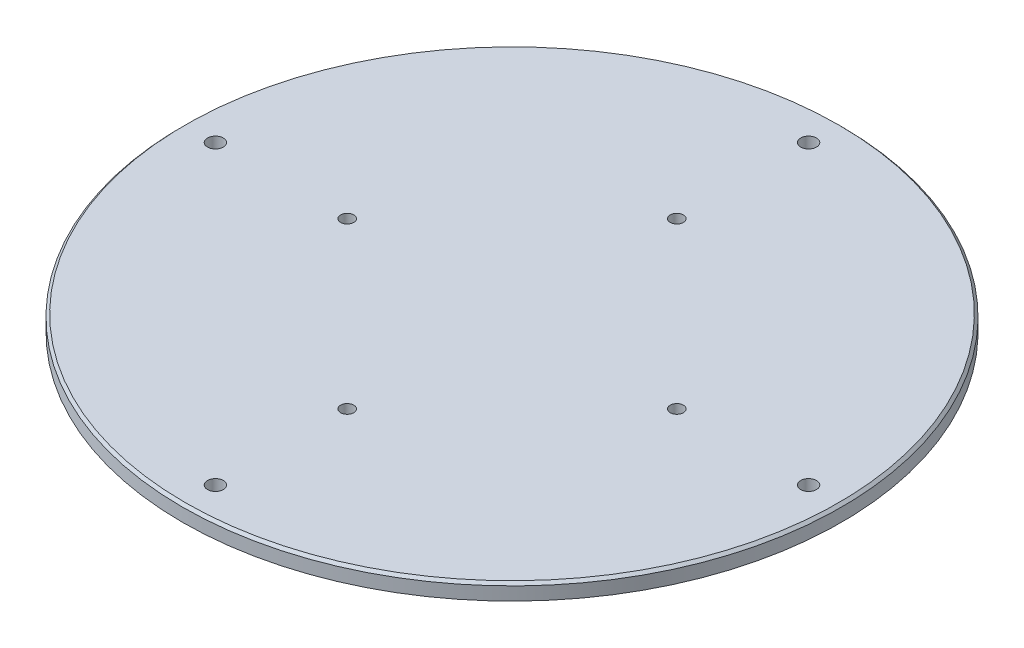
ISO-10303-21;
HEADER;
FILE_DESCRIPTION(('STEP AP214'),'2;1');
FILE_NAME('part.step','',(''),(''),'','','');
FILE_SCHEMA(('AUTOMOTIVE_DESIGN { 1 0 10303 214 1 1 1 1 }'));
ENDSEC;
DATA;
#1=APPLICATION_CONTEXT('core data for automotive mechanical design processes');
#2=APPLICATION_PROTOCOL_DEFINITION('international standard','automotive_design',2000,#1);
#3=PRODUCT_CONTEXT('',#1,'mechanical');
#4=PRODUCT('Part','Part','',(#3));
#5=PRODUCT_RELATED_PRODUCT_CATEGORY('part','',(#4));
#6=PRODUCT_DEFINITION_FORMATION('','',#4);
#7=PRODUCT_DEFINITION_CONTEXT('part definition',#1,'design');
#8=PRODUCT_DEFINITION('design','',#6,#7);
#9=PRODUCT_DEFINITION_SHAPE('','',#8);
#10=(LENGTH_UNIT() NAMED_UNIT(*) SI_UNIT(.MILLI.,.METRE.));
#11=(NAMED_UNIT(*) PLANE_ANGLE_UNIT() SI_UNIT($,.RADIAN.));
#12=(NAMED_UNIT(*) SI_UNIT($,.STERADIAN.) SOLID_ANGLE_UNIT());
#13=UNCERTAINTY_MEASURE_WITH_UNIT(LENGTH_MEASURE(1.E-05),#10,'distance_accuracy_value','');
#14=(GEOMETRIC_REPRESENTATION_CONTEXT(3) GLOBAL_UNCERTAINTY_ASSIGNED_CONTEXT((#13)) GLOBAL_UNIT_ASSIGNED_CONTEXT((#10,
#11,#12)) REPRESENTATION_CONTEXT('',''));
#15=CARTESIAN_POINT('',(0.,0.,0.));
#16=DIRECTION('',(0.,0.,1.));
#17=DIRECTION('',(1.,0.,0.));
#18=AXIS2_PLACEMENT_3D('',#15,#16,#17);
#19=CARTESIAN_POINT('',(0.,6.,0.));
#20=DIRECTION('',(0.,-1.,0.));
#21=DIRECTION('',(0.,0.,-1.));
#22=AXIS2_PLACEMENT_3D('',#19,#20,#21);
#23=CYLINDRICAL_SURFACE('',#22,125.);
#24=CARTESIAN_POINT('',(0.,5.00000000000001,0.));
#25=DIRECTION('',(0.,1.,0.));
#26=DIRECTION('',(0.,0.,1.));
#27=AXIS2_PLACEMENT_3D('',#24,#25,#26);
#28=CIRCLE('',#27,125.);
#29=CARTESIAN_POINT('',(0.,5.00000000000001,125.));
#30=VERTEX_POINT('',#29);
#31=EDGE_CURVE('E10',#30,#30,#28,.F.);
#32=ORIENTED_EDGE('',*,*,#31,.T.);
#33=EDGE_LOOP('',(#32));
#34=FACE_BOUND('',#33,.T.);
#35=CARTESIAN_POINT('',(0.,0.,0.));
#36=DIRECTION('',(0.,1.,0.));
#37=DIRECTION('',(0.,0.,1.));
#38=AXIS2_PLACEMENT_3D('',#35,#36,#37);
#39=CIRCLE('',#38,125.);
#40=CARTESIAN_POINT('',(0.,0.,125.));
#41=VERTEX_POINT('',#40);
#42=EDGE_CURVE('E44',#41,#41,#39,.T.);
#43=ORIENTED_EDGE('',*,*,#42,.T.);
#44=EDGE_LOOP('',(#43));
#45=FACE_BOUND('',#44,.T.);
#46=ADVANCED_FACE('F33',(#34,#45),#23,.T.);
#47=CARTESIAN_POINT('',(0.,6.,0.));
#48=DIRECTION('',(0.,1.,0.));
#49=DIRECTION('',(0.,0.,1.));
#50=AXIS2_PLACEMENT_3D('',#47,#48,#49);
#51=PLANE('',#50);
#52=CARTESIAN_POINT('',(0.,6.,0.));
#53=DIRECTION('',(0.,1.,0.));
#54=DIRECTION('',(0.,0.,1.));
#55=AXIS2_PLACEMENT_3D('',#52,#53,#54);
#56=CIRCLE('',#55,124.);
#57=CARTESIAN_POINT('',(0.,6.,124.));
#58=VERTEX_POINT('',#57);
#59=EDGE_CURVE('E40',#58,#58,#56,.T.);
#60=ORIENTED_EDGE('',*,*,#59,.T.);
#61=EDGE_LOOP('',(#60));
#62=FACE_BOUND('',#61,.T.);
#63=CARTESIAN_POINT('',(-62.5,6.,0.));
#64=DIRECTION('',(0.,1.,0.));
#65=DIRECTION('',(0.,0.,1.));
#66=AXIS2_PLACEMENT_3D('',#63,#64,#65);
#67=CIRCLE('',#66,2.5);
#68=CARTESIAN_POINT('',(-62.5,6.,2.5));
#69=VERTEX_POINT('',#68);
#70=EDGE_CURVE('E92',#69,#69,#67,.T.);
#71=ORIENTED_EDGE('',*,*,#70,.F.);
#72=EDGE_LOOP('',(#71));
#73=FACE_BOUND('',#72,.T.);
#74=CARTESIAN_POINT('',(62.5,6.,0.));
#75=DIRECTION('',(0.,1.,0.));
#76=DIRECTION('',(0.,0.,1.));
#77=AXIS2_PLACEMENT_3D('',#74,#75,#76);
#78=CIRCLE('',#77,2.5);
#79=CARTESIAN_POINT('',(62.5,6.,2.5));
#80=VERTEX_POINT('',#79);
#81=EDGE_CURVE('E86',#80,#80,#78,.T.);
#82=ORIENTED_EDGE('',*,*,#81,.F.);
#83=EDGE_LOOP('',(#82));
#84=FACE_BOUND('',#83,.T.);
#85=CARTESIAN_POINT('',(0.,6.,-62.5));
#86=DIRECTION('',(0.,1.,0.));
#87=DIRECTION('',(0.,0.,1.));
#88=AXIS2_PLACEMENT_3D('',#85,#86,#87);
#89=CIRCLE('',#88,2.5);
#90=CARTESIAN_POINT('',(0.,6.,-60.));
#91=VERTEX_POINT('',#90);
#92=EDGE_CURVE('E80',#91,#91,#89,.T.);
#93=ORIENTED_EDGE('',*,*,#92,.F.);
#94=EDGE_LOOP('',(#93));
#95=FACE_BOUND('',#94,.T.);
#96=CARTESIAN_POINT('',(0.,6.,62.5));
#97=DIRECTION('',(0.,1.,0.));
#98=DIRECTION('',(0.,0.,1.));
#99=AXIS2_PLACEMENT_3D('',#96,#97,#98);
#100=CIRCLE('',#99,2.5);
#101=CARTESIAN_POINT('',(0.,6.,65.));
#102=VERTEX_POINT('',#101);
#103=EDGE_CURVE('E74',#102,#102,#100,.T.);
#104=ORIENTED_EDGE('',*,*,#103,.F.);
#105=EDGE_LOOP('',(#104));
#106=FACE_BOUND('',#105,.T.);
#107=CARTESIAN_POINT('',(112.5,6.,0.));
#108=DIRECTION('',(0.,1.,0.));
#109=DIRECTION('',(0.,0.,1.));
#110=AXIS2_PLACEMENT_3D('',#107,#108,#109);
#111=CIRCLE('',#110,3.00000000000001);
#112=CARTESIAN_POINT('',(112.5,6.,3.00000000000001));
#113=VERTEX_POINT('',#112);
#114=EDGE_CURVE('E55',#113,#113,#111,.T.);
#115=ORIENTED_EDGE('',*,*,#114,.F.);
#116=EDGE_LOOP('',(#115));
#117=FACE_BOUND('',#116,.T.);
#118=CARTESIAN_POINT('',(0.,6.,112.5));
#119=DIRECTION('',(0.,1.,0.));
#120=DIRECTION('',(0.,0.,1.));
#121=AXIS2_PLACEMENT_3D('',#118,#119,#120);
#122=CIRCLE('',#121,3.);
#123=CARTESIAN_POINT('',(0.,6.,115.5));
#124=VERTEX_POINT('',#123);
#125=EDGE_CURVE('E54',#124,#124,#122,.T.);
#126=ORIENTED_EDGE('',*,*,#125,.F.);
#127=EDGE_LOOP('',(#126));
#128=FACE_BOUND('',#127,.T.);
#129=CARTESIAN_POINT('',(-112.5,6.,0.));
#130=DIRECTION('',(0.,1.,0.));
#131=DIRECTION('',(0.,0.,1.));
#132=AXIS2_PLACEMENT_3D('',#129,#130,#131);
#133=CIRCLE('',#132,3.00000000000001);
#134=CARTESIAN_POINT('',(-112.5,6.,3.00000000000001));
#135=VERTEX_POINT('',#134);
#136=EDGE_CURVE('E59',#135,#135,#133,.T.);
#137=ORIENTED_EDGE('',*,*,#136,.F.);
#138=EDGE_LOOP('',(#137));
#139=FACE_BOUND('',#138,.T.);
#140=CARTESIAN_POINT('',(0.,6.,-112.5));
#141=DIRECTION('',(0.,1.,0.));
#142=DIRECTION('',(0.,0.,1.));
#143=AXIS2_PLACEMENT_3D('',#140,#141,#142);
#144=CIRCLE('',#143,3.);
#145=CARTESIAN_POINT('',(0.,6.,-109.5));
#146=VERTEX_POINT('',#145);
#147=EDGE_CURVE('E63',#146,#146,#144,.T.);
#148=ORIENTED_EDGE('',*,*,#147,.F.);
#149=EDGE_LOOP('',(#148));
#150=FACE_BOUND('',#149,.T.);
#151=ADVANCED_FACE('F105',(#62,#73,#84,#95,#106,#117,#128,#139,#150),#51,.T.);
#152=CARTESIAN_POINT('',(0.,0.,0.));
#153=DIRECTION('',(0.,1.,0.));
#154=DIRECTION('',(0.,0.,1.));
#155=AXIS2_PLACEMENT_3D('',#152,#153,#154);
#156=PLANE('',#155);
#157=CARTESIAN_POINT('',(-62.5,0.,0.));
#158=DIRECTION('',(0.,-1.,0.));
#159=DIRECTION('',(0.,0.,-1.));
#160=AXIS2_PLACEMENT_3D('',#157,#158,#159);
#161=CIRCLE('',#160,2.5);
#162=CARTESIAN_POINT('',(-62.5,0.,-2.5));
#163=VERTEX_POINT('',#162);
#164=EDGE_CURVE('E95',#163,#163,#161,.T.);
#165=ORIENTED_EDGE('',*,*,#164,.F.);
#166=EDGE_LOOP('',(#165));
#167=FACE_BOUND('',#166,.T.);
#168=CARTESIAN_POINT('',(62.5,0.,0.));
#169=DIRECTION('',(0.,-1.,0.));
#170=DIRECTION('',(0.,0.,-1.));
#171=AXIS2_PLACEMENT_3D('',#168,#169,#170);
#172=CIRCLE('',#171,2.5);
#173=CARTESIAN_POINT('',(62.5,0.,-2.5));
#174=VERTEX_POINT('',#173);
#175=EDGE_CURVE('E89',#174,#174,#172,.T.);
#176=ORIENTED_EDGE('',*,*,#175,.F.);
#177=EDGE_LOOP('',(#176));
#178=FACE_BOUND('',#177,.T.);
#179=CARTESIAN_POINT('',(0.,0.,-62.5));
#180=DIRECTION('',(0.,-1.,0.));
#181=DIRECTION('',(0.,0.,-1.));
#182=AXIS2_PLACEMENT_3D('',#179,#180,#181);
#183=CIRCLE('',#182,2.5);
#184=CARTESIAN_POINT('',(0.,0.,-65.));
#185=VERTEX_POINT('',#184);
#186=EDGE_CURVE('E83',#185,#185,#183,.T.);
#187=ORIENTED_EDGE('',*,*,#186,.F.);
#188=EDGE_LOOP('',(#187));
#189=FACE_BOUND('',#188,.T.);
#190=CARTESIAN_POINT('',(0.,0.,62.5));
#191=DIRECTION('',(0.,-1.,0.));
#192=DIRECTION('',(0.,0.,-1.));
#193=AXIS2_PLACEMENT_3D('',#190,#191,#192);
#194=CIRCLE('',#193,2.5);
#195=CARTESIAN_POINT('',(0.,0.,60.));
#196=VERTEX_POINT('',#195);
#197=EDGE_CURVE('E77',#196,#196,#194,.T.);
#198=ORIENTED_EDGE('',*,*,#197,.F.);
#199=EDGE_LOOP('',(#198));
#200=FACE_BOUND('',#199,.T.);
#201=CARTESIAN_POINT('',(112.5,0.,0.));
#202=DIRECTION('',(0.,1.,0.));
#203=DIRECTION('',(0.,0.,1.));
#204=AXIS2_PLACEMENT_3D('',#201,#202,#203);
#205=CIRCLE('',#204,3.00000000000001);
#206=CARTESIAN_POINT('',(112.5,0.,3.00000000000001));
#207=VERTEX_POINT('',#206);
#208=EDGE_CURVE('E51',#207,#207,#205,.T.);
#209=ORIENTED_EDGE('',*,*,#208,.T.);
#210=EDGE_LOOP('',(#209));
#211=FACE_BOUND('',#210,.T.);
#212=CARTESIAN_POINT('',(0.,0.,112.5));
#213=DIRECTION('',(0.,1.,0.));
#214=DIRECTION('',(0.,0.,1.));
#215=AXIS2_PLACEMENT_3D('',#212,#213,#214);
#216=CIRCLE('',#215,3.);
#217=CARTESIAN_POINT('',(0.,0.,115.5));
#218=VERTEX_POINT('',#217);
#219=EDGE_CURVE('E56',#218,#218,#216,.T.);
#220=ORIENTED_EDGE('',*,*,#219,.T.);
#221=EDGE_LOOP('',(#220));
#222=FACE_BOUND('',#221,.T.);
#223=CARTESIAN_POINT('',(-112.5,0.,0.));
#224=DIRECTION('',(0.,1.,0.));
#225=DIRECTION('',(0.,0.,1.));
#226=AXIS2_PLACEMENT_3D('',#223,#224,#225);
#227=CIRCLE('',#226,3.00000000000001);
#228=CARTESIAN_POINT('',(-112.5,0.,3.00000000000001));
#229=VERTEX_POINT('',#228);
#230=EDGE_CURVE('E60',#229,#229,#227,.T.);
#231=ORIENTED_EDGE('',*,*,#230,.T.);
#232=EDGE_LOOP('',(#231));
#233=FACE_BOUND('',#232,.T.);
#234=CARTESIAN_POINT('',(0.,0.,-112.5));
#235=DIRECTION('',(0.,1.,0.));
#236=DIRECTION('',(0.,0.,1.));
#237=AXIS2_PLACEMENT_3D('',#234,#235,#236);
#238=CIRCLE('',#237,3.);
#239=CARTESIAN_POINT('',(0.,0.,-109.5));
#240=VERTEX_POINT('',#239);
#241=EDGE_CURVE('E48',#240,#240,#238,.T.);
#242=ORIENTED_EDGE('',*,*,#241,.T.);
#243=EDGE_LOOP('',(#242));
#244=FACE_BOUND('',#243,.T.);
#245=ORIENTED_EDGE('',*,*,#42,.F.);
#246=EDGE_LOOP('',(#245));
#247=FACE_BOUND('',#246,.T.);
#248=ADVANCED_FACE('F101',(#167,#178,#189,#200,#211,#222,#233,#244,#247),#156,.F.);
#249=CARTESIAN_POINT('',(0.,-4.,-112.5));
#250=DIRECTION('',(0.,1.,0.));
#251=DIRECTION('',(0.,0.,1.));
#252=AXIS2_PLACEMENT_3D('',#249,#250,#251);
#253=CYLINDRICAL_SURFACE('',#252,3.);
#254=ORIENTED_EDGE('',*,*,#147,.T.);
#255=EDGE_LOOP('',(#254));
#256=FACE_BOUND('',#255,.T.);
#257=ORIENTED_EDGE('',*,*,#241,.F.);
#258=EDGE_LOOP('',(#257));
#259=FACE_BOUND('',#258,.T.);
#260=ADVANCED_FACE('F104',(#256,#259),#253,.F.);
#261=CARTESIAN_POINT('',(-112.5,-4.,0.));
#262=DIRECTION('',(0.,1.,0.));
#263=DIRECTION('',(0.,0.,1.));
#264=AXIS2_PLACEMENT_3D('',#261,#262,#263);
#265=CYLINDRICAL_SURFACE('',#264,3.00000000000001);
#266=ORIENTED_EDGE('',*,*,#136,.T.);
#267=EDGE_LOOP('',(#266));
#268=FACE_BOUND('',#267,.T.);
#269=ORIENTED_EDGE('',*,*,#230,.F.);
#270=EDGE_LOOP('',(#269));
#271=FACE_BOUND('',#270,.T.);
#272=ADVANCED_FACE('F131',(#268,#271),#265,.F.);
#273=CARTESIAN_POINT('',(0.,-4.,112.5));
#274=DIRECTION('',(0.,1.,0.));
#275=DIRECTION('',(0.,0.,1.));
#276=AXIS2_PLACEMENT_3D('',#273,#274,#275);
#277=CYLINDRICAL_SURFACE('',#276,3.);
#278=ORIENTED_EDGE('',*,*,#125,.T.);
#279=EDGE_LOOP('',(#278));
#280=FACE_BOUND('',#279,.T.);
#281=ORIENTED_EDGE('',*,*,#219,.F.);
#282=EDGE_LOOP('',(#281));
#283=FACE_BOUND('',#282,.T.);
#284=ADVANCED_FACE('F135',(#280,#283),#277,.F.);
#285=CARTESIAN_POINT('',(112.5,-4.,0.));
#286=DIRECTION('',(0.,1.,0.));
#287=DIRECTION('',(0.,0.,1.));
#288=AXIS2_PLACEMENT_3D('',#285,#286,#287);
#289=CYLINDRICAL_SURFACE('',#288,3.00000000000001);
#290=ORIENTED_EDGE('',*,*,#114,.T.);
#291=EDGE_LOOP('',(#290));
#292=FACE_BOUND('',#291,.T.);
#293=ORIENTED_EDGE('',*,*,#208,.F.);
#294=EDGE_LOOP('',(#293));
#295=FACE_BOUND('',#294,.T.);
#296=ADVANCED_FACE('F139',(#292,#295),#289,.F.);
#297=CARTESIAN_POINT('',(0.,10.,62.5));
#298=DIRECTION('',(0.,-1.,0.));
#299=DIRECTION('',(0.,0.,-1.));
#300=AXIS2_PLACEMENT_3D('',#297,#298,#299);
#301=CYLINDRICAL_SURFACE('',#300,2.5);
#302=ORIENTED_EDGE('',*,*,#103,.T.);
#303=EDGE_LOOP('',(#302));
#304=FACE_BOUND('',#303,.T.);
#305=ORIENTED_EDGE('',*,*,#197,.T.);
#306=EDGE_LOOP('',(#305));
#307=FACE_BOUND('',#306,.T.);
#308=ADVANCED_FACE('F143',(#304,#307),#301,.F.);
#309=CARTESIAN_POINT('',(0.,10.,-62.5));
#310=DIRECTION('',(0.,-1.,0.));
#311=DIRECTION('',(0.,0.,-1.));
#312=AXIS2_PLACEMENT_3D('',#309,#310,#311);
#313=CYLINDRICAL_SURFACE('',#312,2.5);
#314=ORIENTED_EDGE('',*,*,#92,.T.);
#315=EDGE_LOOP('',(#314));
#316=FACE_BOUND('',#315,.T.);
#317=ORIENTED_EDGE('',*,*,#186,.T.);
#318=EDGE_LOOP('',(#317));
#319=FACE_BOUND('',#318,.T.);
#320=ADVANCED_FACE('F147',(#316,#319),#313,.F.);
#321=CARTESIAN_POINT('',(62.5,10.,0.));
#322=DIRECTION('',(0.,-1.,0.));
#323=DIRECTION('',(0.,0.,-1.));
#324=AXIS2_PLACEMENT_3D('',#321,#322,#323);
#325=CYLINDRICAL_SURFACE('',#324,2.5);
#326=ORIENTED_EDGE('',*,*,#81,.T.);
#327=EDGE_LOOP('',(#326));
#328=FACE_BOUND('',#327,.T.);
#329=ORIENTED_EDGE('',*,*,#175,.T.);
#330=EDGE_LOOP('',(#329));
#331=FACE_BOUND('',#330,.T.);
#332=ADVANCED_FACE('F151',(#328,#331),#325,.F.);
#333=CARTESIAN_POINT('',(-62.5,10.,0.));
#334=DIRECTION('',(0.,-1.,0.));
#335=DIRECTION('',(0.,0.,-1.));
#336=AXIS2_PLACEMENT_3D('',#333,#334,#335);
#337=CYLINDRICAL_SURFACE('',#336,2.5);
#338=ORIENTED_EDGE('',*,*,#70,.T.);
#339=EDGE_LOOP('',(#338));
#340=FACE_BOUND('',#339,.T.);
#341=ORIENTED_EDGE('',*,*,#164,.T.);
#342=EDGE_LOOP('',(#341));
#343=FACE_BOUND('',#342,.T.);
#344=ADVANCED_FACE('F99',(#340,#343),#337,.F.);
#345=CARTESIAN_POINT('',(0.,6.,0.));
#346=DIRECTION('',(0.,-1.,0.));
#347=DIRECTION('',(0.,0.,-1.));
#348=AXIS2_PLACEMENT_3D('',#345,#346,#347);
#349=CONICAL_SURFACE('',#348,124.,0.785398163397455);
#350=ORIENTED_EDGE('',*,*,#31,.F.);
#351=EDGE_LOOP('',(#350));
#352=FACE_BOUND('',#351,.T.);
#353=ORIENTED_EDGE('',*,*,#59,.F.);
#354=EDGE_LOOP('',(#353));
#355=FACE_BOUND('',#354,.T.);
#356=ADVANCED_FACE('F35',(#352,#355),#349,.T.);
#357=CLOSED_SHELL('',(#46,#151,#248,#260,#272,#284,#296,#308,#320,#332,#344,#356));
#358=MANIFOLD_SOLID_BREP('B2',#357);
#359=ADVANCED_BREP_SHAPE_REPRESENTATION('',(#18,#358),#14);
#360=SHAPE_DEFINITION_REPRESENTATION(#9,#359);
ENDSEC;
END-ISO-10303-21;
